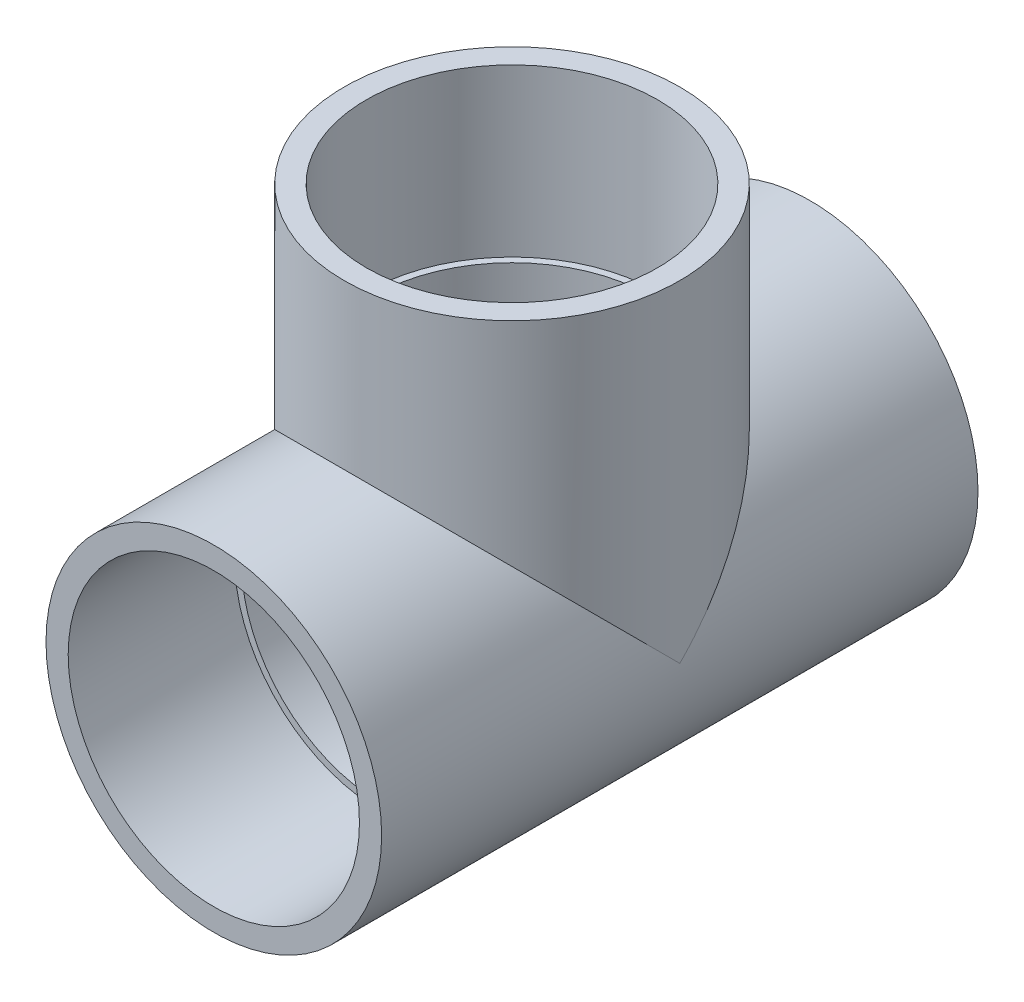
ISO-10303-21;
HEADER;
FILE_DESCRIPTION(('STEP AP214'),'2;1');
FILE_NAME('part.step','',(''),(''),'','','');
FILE_SCHEMA(('AUTOMOTIVE_DESIGN { 1 0 10303 214 1 1 1 1 }'));
ENDSEC;
DATA;
#1=APPLICATION_CONTEXT('core data for automotive mechanical design processes');
#2=APPLICATION_PROTOCOL_DEFINITION('international standard','automotive_design',2000,#1);
#3=PRODUCT_CONTEXT('',#1,'mechanical');
#4=PRODUCT('Part','Part','',(#3));
#5=PRODUCT_RELATED_PRODUCT_CATEGORY('part','',(#4));
#6=PRODUCT_DEFINITION_FORMATION('','',#4);
#7=PRODUCT_DEFINITION_CONTEXT('part definition',#1,'design');
#8=PRODUCT_DEFINITION('design','',#6,#7);
#9=PRODUCT_DEFINITION_SHAPE('','',#8);
#10=(LENGTH_UNIT() NAMED_UNIT(*) SI_UNIT(.MILLI.,.METRE.));
#11=(NAMED_UNIT(*) PLANE_ANGLE_UNIT() SI_UNIT($,.RADIAN.));
#12=(NAMED_UNIT(*) SI_UNIT($,.STERADIAN.) SOLID_ANGLE_UNIT());
#13=UNCERTAINTY_MEASURE_WITH_UNIT(LENGTH_MEASURE(1.E-05),#10,'distance_accuracy_value','');
#14=(GEOMETRIC_REPRESENTATION_CONTEXT(3) GLOBAL_UNCERTAINTY_ASSIGNED_CONTEXT((#13)) GLOBAL_UNIT_ASSIGNED_CONTEXT((#10,
#11,#12)) REPRESENTATION_CONTEXT('',''));
#15=CARTESIAN_POINT('',(0.,0.,0.));
#16=DIRECTION('',(0.,0.,1.));
#17=DIRECTION('',(1.,0.,0.));
#18=AXIS2_PLACEMENT_3D('',#15,#16,#17);
#19=CARTESIAN_POINT('',(0.,-19.20975,0.));
#20=DIRECTION('',(0.,1.,0.));
#21=DIRECTION('',(0.,0.,1.));
#22=AXIS2_PLACEMENT_3D('',#19,#20,#21);
#23=CYLINDRICAL_SURFACE('',#22,15.875);
#24=DIRECTION('',(0.,1.,0.));
#25=VECTOR('',#24,1.);
#26=CARTESIAN_POINT('',(-4.95696716122873,-19.20975,-15.08125));
#27=LINE('',#26,#25);
#28=CARTESIAN_POINT('',(-4.95696716122873,15.9146380142622,-15.08125));
#29=VERTEX_POINT('',#28);
#30=CARTESIAN_POINT('',(-4.95696716122871,15.08125,-15.08125));
#31=VERTEX_POINT('',#30);
#32=EDGE_CURVE('E11',#29,#31,#27,.F.);
#33=ORIENTED_EDGE('',*,*,#32,.F.);
#34=CARTESIAN_POINT('',(-4.95696716122873,15.9146380142622,-15.08125));
#35=CARTESIAN_POINT('',(-4.65183462890192,16.0097259451218,-15.1815889047642));
#36=CARTESIAN_POINT('',(-4.34128391480013,16.0967795439269,-15.2733544015873));
#37=CARTESIAN_POINT('',(-3.71092676901157,16.2536579955444,-15.4386042265133));
#38=CARTESIAN_POINT('',(-3.39111550476718,16.3234736649942,-15.5120788104566));
#39=CARTESIAN_POINT('',(-2.74453463538701,16.4445397561756,-15.6394267284181));
#40=CARTESIAN_POINT('',(-2.41777385075769,16.4958123794082,-15.6933235031964));
#41=CARTESIAN_POINT('',(-1.75915923195019,16.5789837090621,-15.7807250136814));
#42=CARTESIAN_POINT('',(-1.42730653113009,16.6108866644434,-15.8142342216392));
#43=CARTESIAN_POINT('',(-0.759609398359231,16.6548059696738,-15.8603597011864));
#44=CARTESIAN_POINT('',(-0.423754819022063,16.666749325366,-15.8728992849713));
#45=CARTESIAN_POINT('',(0.248225549854419,16.6702885713706,-15.876615506258));
#46=CARTESIAN_POINT('',(0.584351370647446,16.6618816280552,-15.8677891687143));
#47=CARTESIAN_POINT('',(1.25396731751022,16.6248948866689,-15.8289470117087));
#48=CARTESIAN_POINT('',(1.58745944984446,16.59633232747,-15.7989492998825));
#49=CARTESIAN_POINT('',(2.24952692115763,16.5196221631518,-15.7183481028989));
#50=CARTESIAN_POINT('',(2.57810370902756,16.4714804521898,-15.667750819084));
#51=CARTESIAN_POINT('',(3.25556478140146,16.3516512375056,-15.5417280360875));
#52=CARTESIAN_POINT('',(3.60384285497748,16.2783284156218,-15.4645769816068));
#53=CARTESIAN_POINT('',(4.1179248633398,16.1530501746161,-15.3326324084872));
#54=CARTESIAN_POINT('',(4.28778473863848,16.1087767170582,-15.2859847525171));
#55=CARTESIAN_POINT('',(4.62459774901306,16.0153317475723,-15.1874781028532));
#56=CARTESIAN_POINT('',(4.79155125400754,15.9661608644159,-15.1356197781404));
#57=CARTESIAN_POINT('',(4.95696716122873,15.9146380142622,-15.08125));
#58=B_SPLINE_CURVE_WITH_KNOTS('',3,(#34,#35,#36,#37,#38,#39,#40,#41,#42,#43,#44,#45,#46,#47,#48,
#49,#50,#51,#52,#53,#54,#55,#56,#57),.UNSPECIFIED.,.F.,.F.,(4,2,2,2,2,2,2,2,2,2,2,4),(0.,
1.00483999289581,2.01021415640429,3.014380573691,4.01832663583933,5.02593625380128,
6.03368618197726,7.04057523598532,8.04716139767047,9.1381159351191,9.68285986608592,
10.2275339482952),.UNSPECIFIED.);
#59=CARTESIAN_POINT('',(4.95696716122873,15.9146380142622,-15.08125));
#60=VERTEX_POINT('',#59);
#61=EDGE_CURVE('E88',#29,#60,#58,.T.);
#62=ORIENTED_EDGE('',*,*,#61,.T.);
#63=DIRECTION('',(0.,1.,0.));
#64=VECTOR('',#63,1.);
#65=CARTESIAN_POINT('',(4.95696716122873,-19.20975,-15.08125));
#66=LINE('',#65,#64);
#67=CARTESIAN_POINT('',(4.95696716122873,15.08125,-15.08125));
#68=VERTEX_POINT('',#67);
#69=EDGE_CURVE('E44',#68,#60,#66,.T.);
#70=ORIENTED_EDGE('',*,*,#69,.F.);
#71=CARTESIAN_POINT('',(0.,0.,0.));
#72=DIRECTION('',(0.,0.707106781186547,0.707106781186547));
#73=DIRECTION('',(0.,0.707106781186547,-0.707106781186547));
#74=AXIS2_PLACEMENT_3D('',#71,#72,#73);
#75=ELLIPSE('',#74,22.4506403026729,15.875);
#76=CARTESIAN_POINT('',(15.875,0.,0.));
#77=VERTEX_POINT('',#76);
#78=EDGE_CURVE('E106',#68,#77,#75,.F.);
#79=ORIENTED_EDGE('',*,*,#78,.T.);
#80=CARTESIAN_POINT('',(0.,0.,0.));
#81=DIRECTION('',(0.,0.707106781186547,-0.707106781186547));
#82=DIRECTION('',(0.,0.707106781186547,0.707106781186547));
#83=AXIS2_PLACEMENT_3D('',#80,#81,#82);
#84=ELLIPSE('',#83,22.4506403026729,15.875);
#85=CARTESIAN_POINT('',(4.95696716122873,15.08125,15.08125));
#86=VERTEX_POINT('',#85);
#87=EDGE_CURVE('E111',#77,#86,#84,.F.);
#88=ORIENTED_EDGE('',*,*,#87,.T.);
#89=DIRECTION('',(0.,1.,0.));
#90=VECTOR('',#89,1.);
#91=CARTESIAN_POINT('',(4.95696716122873,-19.20975,15.08125));
#92=LINE('',#91,#90);
#93=CARTESIAN_POINT('',(4.95696716122873,15.9146380142622,15.08125));
#94=VERTEX_POINT('',#93);
#95=EDGE_CURVE('E138',#94,#86,#92,.F.);
#96=ORIENTED_EDGE('',*,*,#95,.F.);
#97=CARTESIAN_POINT('',(4.95696716122873,15.9146380142622,15.08125));
#98=CARTESIAN_POINT('',(4.65183462890192,16.0097259451218,15.1815889047642));
#99=CARTESIAN_POINT('',(4.34128391480013,16.096779543927,15.2733544015873));
#100=CARTESIAN_POINT('',(3.71092676901157,16.2536579955444,15.4386042265133));
#101=CARTESIAN_POINT('',(3.39111550476718,16.3234736649942,15.5120788104566));
#102=CARTESIAN_POINT('',(2.74453463538701,16.4445397561756,15.6394267284181));
#103=CARTESIAN_POINT('',(2.41777385075769,16.4958123794082,15.6933235031964));
#104=CARTESIAN_POINT('',(1.75915923195018,16.5789837090621,15.7807250136814));
#105=CARTESIAN_POINT('',(1.42730653113009,16.6108866644434,15.8142342216392));
#106=CARTESIAN_POINT('',(0.75960939835923,16.6548059696738,15.8603597011864));
#107=CARTESIAN_POINT('',(0.423754819022063,16.666749325366,15.8728992849713));
#108=CARTESIAN_POINT('',(-0.248225549854419,16.6702885713706,15.876615506258));
#109=CARTESIAN_POINT('',(-0.584351370647447,16.6618816280552,15.8677891687143));
#110=CARTESIAN_POINT('',(-1.25396731751022,16.6248948866689,15.8289470117087));
#111=CARTESIAN_POINT('',(-1.58745944984446,16.59633232747,15.7989492998825));
#112=CARTESIAN_POINT('',(-2.24952692115763,16.5196221631518,15.7183481028989));
#113=CARTESIAN_POINT('',(-2.57810370902756,16.4714804521898,15.667750819084));
#114=CARTESIAN_POINT('',(-3.25556478140147,16.3516512375056,15.5417280360875));
#115=CARTESIAN_POINT('',(-3.60384285497748,16.2783284156218,15.4645769816068));
#116=CARTESIAN_POINT('',(-4.1179248633398,16.153050174616,15.3326324084872));
#117=CARTESIAN_POINT('',(-4.28778473863847,16.1087767170582,15.2859847525171));
#118=CARTESIAN_POINT('',(-4.62459774901306,16.0153317475723,15.1874781028532));
#119=CARTESIAN_POINT('',(-4.79155125400753,15.9661608644159,15.1356197781404));
#120=CARTESIAN_POINT('',(-4.95696716122873,15.9146380142622,15.08125));
#121=B_SPLINE_CURVE_WITH_KNOTS('',3,(#97,#98,#99,#100,#101,#102,#103,#104,#105,#106,#107,#108,
#109,#110,#111,#112,#113,#114,#115,#116,#117,#118,#119,#120),.UNSPECIFIED.,.F.,.F.,(4,2,2,2,2,2,
2,2,2,2,2,4),(0.,1.00483999289582,2.01021415640429,3.014380573691,4.01832663583933,
5.02593625380128,6.03368618197726,7.04057523598533,8.04716139767047,9.1381159351191,
9.68285986608592,10.2275339482952),.UNSPECIFIED.);
#122=CARTESIAN_POINT('',(-4.95696716122873,15.9146380142622,15.08125));
#123=VERTEX_POINT('',#122);
#124=EDGE_CURVE('E130',#94,#123,#121,.T.);
#125=ORIENTED_EDGE('',*,*,#124,.T.);
#126=DIRECTION('',(0.,1.,0.));
#127=VECTOR('',#126,1.);
#128=CARTESIAN_POINT('',(-4.95696716122873,-19.20975,15.08125));
#129=LINE('',#128,#127);
#130=CARTESIAN_POINT('',(-4.95696716122873,15.08125,15.08125));
#131=VERTEX_POINT('',#130);
#132=EDGE_CURVE('E128',#131,#123,#129,.T.);
#133=ORIENTED_EDGE('',*,*,#132,.F.);
#134=CARTESIAN_POINT('',(-15.875,0.,0.));
#135=VERTEX_POINT('',#134);
#136=EDGE_CURVE('E103',#131,#135,#84,.F.);
#137=ORIENTED_EDGE('',*,*,#136,.T.);
#138=EDGE_CURVE('E101',#135,#31,#75,.F.);
#139=ORIENTED_EDGE('',*,*,#138,.T.);
#140=EDGE_LOOP('',(#33,#62,#70,#79,#88,#96,#125,#133,#137,#139));
#141=FACE_BOUND('',#140,.T.);
#142=CARTESIAN_POINT('',(0.,18.89125,0.));
#143=DIRECTION('',(0.,1.,0.));
#144=DIRECTION('',(0.,0.,1.));
#145=AXIS2_PLACEMENT_3D('',#142,#143,#144);
#146=CIRCLE('',#145,15.875);
#147=CARTESIAN_POINT('',(0.,18.89125,15.875));
#148=VERTEX_POINT('',#147);
#149=EDGE_CURVE('E39',#148,#148,#146,.F.);
#150=ORIENTED_EDGE('',*,*,#149,.F.);
#151=EDGE_LOOP('',(#150));
#152=FACE_BOUND('',#151,.T.);
#153=ADVANCED_FACE('F35',(#141,#152),#23,.F.);
#154=CARTESIAN_POINT('',(0.,0.,-34.13125));
#155=DIRECTION('',(0.,0.,1.));
#156=DIRECTION('',(1.,0.,0.));
#157=AXIS2_PLACEMENT_3D('',#154,#155,#156);
#158=CYLINDRICAL_SURFACE('',#157,15.875);
#159=CARTESIAN_POINT('',(0.,0.,-15.08125));
#160=DIRECTION('',(0.,0.,-1.));
#161=DIRECTION('',(-1.,0.,0.));
#162=AXIS2_PLACEMENT_3D('',#159,#160,#161);
#163=CIRCLE('',#162,15.875);
#164=EDGE_CURVE('E50',#31,#68,#163,.F.);
#165=ORIENTED_EDGE('',*,*,#164,.F.);
#166=ORIENTED_EDGE('',*,*,#138,.F.);
#167=ORIENTED_EDGE('',*,*,#136,.F.);
#168=CARTESIAN_POINT('',(0.,0.,15.08125));
#169=DIRECTION('',(0.,0.,1.));
#170=DIRECTION('',(1.,0.,0.));
#171=AXIS2_PLACEMENT_3D('',#168,#169,#170);
#172=CIRCLE('',#171,15.875);
#173=EDGE_CURVE('E58',#86,#131,#172,.F.);
#174=ORIENTED_EDGE('',*,*,#173,.F.);
#175=ORIENTED_EDGE('',*,*,#87,.F.);
#176=ORIENTED_EDGE('',*,*,#78,.F.);
#177=EDGE_LOOP('',(#165,#166,#167,#174,#175,#176));
#178=FACE_BOUND('',#177,.T.);
#179=ADVANCED_FACE('F179',(#178),#158,.F.);
#180=CARTESIAN_POINT('',(0.,0.,118.243982536796));
#181=DIRECTION('',(0.,0.,-1.));
#182=DIRECTION('',(-1.,0.,0.));
#183=AXIS2_PLACEMENT_3D('',#180,#181,#182);
#184=CYLINDRICAL_SURFACE('',#183,19.20875);
#185=CARTESIAN_POINT('',(0.,0.,0.));
#186=DIRECTION('',(0.,-0.707106781186547,-0.707106781186547));
#187=DIRECTION('',(0.,0.707106781186547,-0.707106781186547));
#188=AXIS2_PLACEMENT_3D('',#185,#186,#187);
#189=ELLIPSE('',#188,27.1652747662341,19.20875);
#190=CARTESIAN_POINT('',(-19.2087499999999,0.,0.));
#191=VERTEX_POINT('',#190);
#192=CARTESIAN_POINT('',(19.20875,0.,0.));
#193=VERTEX_POINT('',#192);
#194=EDGE_CURVE('E122',#191,#193,#189,.T.);
#195=ORIENTED_EDGE('',*,*,#194,.T.);
#196=CARTESIAN_POINT('',(0.,0.,0.));
#197=DIRECTION('',(0.,0.707106781186547,-0.707106781186547));
#198=DIRECTION('',(0.,-0.707106781186547,-0.707106781186547));
#199=AXIS2_PLACEMENT_3D('',#196,#197,#198);
#200=ELLIPSE('',#199,27.1652747662341,19.20875);
#201=EDGE_CURVE('E125',#193,#191,#200,.F.);
#202=ORIENTED_EDGE('',*,*,#201,.T.);
#203=EDGE_LOOP('',(#195,#202));
#204=FACE_BOUND('',#203,.T.);
#205=CARTESIAN_POINT('',(0.,0.,-34.13125));
#206=DIRECTION('',(0.,0.,-1.));
#207=DIRECTION('',(-1.,0.,0.));
#208=AXIS2_PLACEMENT_3D('',#205,#206,#207);
#209=CIRCLE('',#208,19.20875);
#210=CARTESIAN_POINT('',(-19.2087499999999,0.,-34.13125));
#211=VERTEX_POINT('',#210);
#212=EDGE_CURVE('E119',#211,#211,#209,.T.);
#213=ORIENTED_EDGE('',*,*,#212,.F.);
#214=EDGE_LOOP('',(#213));
#215=FACE_BOUND('',#214,.T.);
#216=CARTESIAN_POINT('',(0.,0.,34.13125));
#217=DIRECTION('',(0.,0.,-1.));
#218=DIRECTION('',(-1.,0.,0.));
#219=AXIS2_PLACEMENT_3D('',#216,#217,#218);
#220=CIRCLE('',#219,19.20875);
#221=CARTESIAN_POINT('',(-19.2087499999999,0.,34.13125));
#222=VERTEX_POINT('',#221);
#223=EDGE_CURVE('E109',#222,#222,#220,.T.);
#224=ORIENTED_EDGE('',*,*,#223,.T.);
#225=EDGE_LOOP('',(#224));
#226=FACE_BOUND('',#225,.T.);
#227=ADVANCED_FACE('F37',(#204,#215,#226),#184,.T.);
#228=CARTESIAN_POINT('',(19.20875,0.,-34.13125));
#229=DIRECTION('',(0.,0.,1.));
#230=DIRECTION('',(1.,0.,0.));
#231=AXIS2_PLACEMENT_3D('',#228,#229,#230);
#232=PLANE('',#231);
#233=CARTESIAN_POINT('',(0.,0.,-34.13125));
#234=DIRECTION('',(0.,0.,-1.));
#235=DIRECTION('',(-1.,0.,0.));
#236=AXIS2_PLACEMENT_3D('',#233,#234,#235);
#237=CIRCLE('',#236,16.66875);
#238=CARTESIAN_POINT('',(-16.66875,0.,-34.13125));
#239=VERTEX_POINT('',#238);
#240=EDGE_CURVE('E96',#239,#239,#237,.T.);
#241=ORIENTED_EDGE('',*,*,#240,.F.);
#242=EDGE_LOOP('',(#241));
#243=FACE_BOUND('',#242,.T.);
#244=ORIENTED_EDGE('',*,*,#212,.T.);
#245=EDGE_LOOP('',(#244));
#246=FACE_BOUND('',#245,.T.);
#247=ADVANCED_FACE('F174',(#243,#246),#232,.F.);
#248=CARTESIAN_POINT('',(0.,0.,34.13125));
#249=DIRECTION('',(0.,0.,-1.));
#250=DIRECTION('',(-1.,0.,0.));
#251=AXIS2_PLACEMENT_3D('',#248,#249,#250);
#252=PLANE('',#251);
#253=CARTESIAN_POINT('',(0.,0.,34.13125));
#254=DIRECTION('',(0.,0.,1.));
#255=DIRECTION('',(1.,0.,0.));
#256=AXIS2_PLACEMENT_3D('',#253,#254,#255);
#257=CIRCLE('',#256,16.66875);
#258=CARTESIAN_POINT('',(16.66875,0.,34.13125));
#259=VERTEX_POINT('',#258);
#260=EDGE_CURVE('E163',#259,#259,#257,.T.);
#261=ORIENTED_EDGE('',*,*,#260,.F.);
#262=EDGE_LOOP('',(#261));
#263=FACE_BOUND('',#262,.T.);
#264=ORIENTED_EDGE('',*,*,#223,.F.);
#265=EDGE_LOOP('',(#264));
#266=FACE_BOUND('',#265,.T.);
#267=ADVANCED_FACE('F170',(#263,#266),#252,.F.);
#268=CARTESIAN_POINT('',(0.,0.,0.));
#269=DIRECTION('',(0.,1.,0.));
#270=DIRECTION('',(0.,0.,1.));
#271=AXIS2_PLACEMENT_3D('',#268,#269,#270);
#272=CYLINDRICAL_SURFACE('',#271,19.2087499999999);
#273=CARTESIAN_POINT('',(0.,37.94125,0.));
#274=DIRECTION('',(0.,1.,0.));
#275=DIRECTION('',(0.,0.,1.));
#276=AXIS2_PLACEMENT_3D('',#273,#274,#275);
#277=CIRCLE('',#276,19.2087499999999);
#278=CARTESIAN_POINT('',(0.,37.94125,19.2087499999999));
#279=VERTEX_POINT('',#278);
#280=EDGE_CURVE('E105',#279,#279,#277,.T.);
#281=ORIENTED_EDGE('',*,*,#280,.F.);
#282=EDGE_LOOP('',(#281));
#283=FACE_BOUND('',#282,.T.);
#284=ORIENTED_EDGE('',*,*,#201,.F.);
#285=ORIENTED_EDGE('',*,*,#194,.F.);
#286=EDGE_LOOP('',(#284,#285));
#287=FACE_BOUND('',#286,.T.);
#288=ADVANCED_FACE('F173',(#283,#287),#272,.T.);
#289=CARTESIAN_POINT('',(0.,37.94125,0.));
#290=DIRECTION('',(0.,1.,0.));
#291=DIRECTION('',(0.,0.,1.));
#292=AXIS2_PLACEMENT_3D('',#289,#290,#291);
#293=PLANE('',#292);
#294=CARTESIAN_POINT('',(0.,37.94125,0.));
#295=DIRECTION('',(0.,1.,0.));
#296=DIRECTION('',(0.,0.,1.));
#297=AXIS2_PLACEMENT_3D('',#294,#295,#296);
#298=CIRCLE('',#297,16.66875);
#299=CARTESIAN_POINT('',(0.,37.94125,16.66875));
#300=VERTEX_POINT('',#299);
#301=EDGE_CURVE('E250',#300,#300,#298,.T.);
#302=ORIENTED_EDGE('',*,*,#301,.F.);
#303=EDGE_LOOP('',(#302));
#304=FACE_BOUND('',#303,.T.);
#305=ORIENTED_EDGE('',*,*,#280,.T.);
#306=EDGE_LOOP('',(#305));
#307=FACE_BOUND('',#306,.T.);
#308=ADVANCED_FACE('F147',(#304,#307),#293,.T.);
#309=CARTESIAN_POINT('',(0.,0.,15.08125));
#310=DIRECTION('',(0.,0.,1.));
#311=DIRECTION('',(1.,0.,0.));
#312=AXIS2_PLACEMENT_3D('',#309,#310,#311);
#313=CYLINDRICAL_SURFACE('',#312,16.66875);
#314=ORIENTED_EDGE('',*,*,#260,.T.);
#315=EDGE_LOOP('',(#314));
#316=FACE_BOUND('',#315,.T.);
#317=CARTESIAN_POINT('',(0.,0.,15.08125));
#318=DIRECTION('',(0.,0.,1.));
#319=DIRECTION('',(1.,0.,0.));
#320=AXIS2_PLACEMENT_3D('',#317,#318,#319);
#321=CIRCLE('',#320,16.66875);
#322=EDGE_CURVE('E164',#123,#94,#321,.T.);
#323=ORIENTED_EDGE('',*,*,#322,.F.);
#324=ORIENTED_EDGE('',*,*,#124,.F.);
#325=EDGE_LOOP('',(#323,#324));
#326=FACE_BOUND('',#325,.T.);
#327=ADVANCED_FACE('F142',(#316,#326),#313,.F.);
#328=CARTESIAN_POINT('',(0.,0.,15.08125));
#329=DIRECTION('',(0.,0.,1.));
#330=DIRECTION('',(1.,0.,0.));
#331=AXIS2_PLACEMENT_3D('',#328,#329,#330);
#332=PLANE('',#331);
#333=ORIENTED_EDGE('',*,*,#95,.T.);
#334=ORIENTED_EDGE('',*,*,#173,.T.);
#335=ORIENTED_EDGE('',*,*,#132,.T.);
#336=ORIENTED_EDGE('',*,*,#322,.T.);
#337=EDGE_LOOP('',(#333,#334,#335,#336));
#338=FACE_BOUND('',#337,.T.);
#339=ADVANCED_FACE('F146',(#338),#332,.T.);
#340=CARTESIAN_POINT('',(0.,0.,-15.08125));
#341=DIRECTION('',(0.,0.,-1.));
#342=DIRECTION('',(-1.,0.,0.));
#343=AXIS2_PLACEMENT_3D('',#340,#341,#342);
#344=PLANE('',#343);
#345=ORIENTED_EDGE('',*,*,#32,.T.);
#346=ORIENTED_EDGE('',*,*,#164,.T.);
#347=ORIENTED_EDGE('',*,*,#69,.T.);
#348=CARTESIAN_POINT('',(0.,0.,-15.08125));
#349=DIRECTION('',(0.,0.,-1.));
#350=DIRECTION('',(-1.,0.,0.));
#351=AXIS2_PLACEMENT_3D('',#348,#349,#350);
#352=CIRCLE('',#351,16.66875);
#353=EDGE_CURVE('E91',#60,#29,#352,.T.);
#354=ORIENTED_EDGE('',*,*,#353,.T.);
#355=EDGE_LOOP('',(#345,#346,#347,#354));
#356=FACE_BOUND('',#355,.T.);
#357=ADVANCED_FACE('F95',(#356),#344,.T.);
#358=CARTESIAN_POINT('',(0.,0.,-15.08125));
#359=DIRECTION('',(0.,0.,-1.));
#360=DIRECTION('',(-1.,0.,0.));
#361=AXIS2_PLACEMENT_3D('',#358,#359,#360);
#362=CYLINDRICAL_SURFACE('',#361,16.66875);
#363=ORIENTED_EDGE('',*,*,#240,.T.);
#364=EDGE_LOOP('',(#363));
#365=FACE_BOUND('',#364,.T.);
#366=ORIENTED_EDGE('',*,*,#353,.F.);
#367=ORIENTED_EDGE('',*,*,#61,.F.);
#368=EDGE_LOOP('',(#366,#367));
#369=FACE_BOUND('',#368,.T.);
#370=ADVANCED_FACE('F90',(#365,#369),#362,.F.);
#371=CARTESIAN_POINT('',(0.,18.89125,0.));
#372=DIRECTION('',(0.,1.,0.));
#373=DIRECTION('',(0.,0.,1.));
#374=AXIS2_PLACEMENT_3D('',#371,#372,#373);
#375=PLANE('',#374);
#376=CARTESIAN_POINT('',(0.,18.89125,0.));
#377=DIRECTION('',(0.,1.,0.));
#378=DIRECTION('',(0.,0.,1.));
#379=AXIS2_PLACEMENT_3D('',#376,#377,#378);
#380=CIRCLE('',#379,16.66875);
#381=CARTESIAN_POINT('',(0.,18.89125,16.66875));
#382=VERTEX_POINT('',#381);
#383=EDGE_CURVE('E247',#382,#382,#380,.T.);
#384=ORIENTED_EDGE('',*,*,#383,.T.);
#385=EDGE_LOOP('',(#384));
#386=FACE_BOUND('',#385,.T.);
#387=ORIENTED_EDGE('',*,*,#149,.T.);
#388=EDGE_LOOP('',(#387));
#389=FACE_BOUND('',#388,.T.);
#390=ADVANCED_FACE('F154',(#386,#389),#375,.T.);
#391=CARTESIAN_POINT('',(0.,18.89125,0.));
#392=DIRECTION('',(0.,1.,0.));
#393=DIRECTION('',(0.,0.,1.));
#394=AXIS2_PLACEMENT_3D('',#391,#392,#393);
#395=CYLINDRICAL_SURFACE('',#394,16.66875);
#396=CARTESIAN_POINT('',(0.,18.89125,16.66875));
#397=CARTESIAN_POINT('',(0.,19.0896875,16.66875));
#398=CARTESIAN_POINT('',(0.,19.288125,16.66875));
#399=CARTESIAN_POINT('',(0.,19.685,16.66875));
#400=CARTESIAN_POINT('',(0.,19.8834375,16.66875));
#401=CARTESIAN_POINT('',(0.,20.2803125,16.66875));
#402=CARTESIAN_POINT('',(0.,20.47875,16.66875));
#403=CARTESIAN_POINT('',(0.,20.875625,16.66875));
#404=CARTESIAN_POINT('',(0.,21.0740625,16.66875));
#405=CARTESIAN_POINT('',(0.,21.4709375,16.66875));
#406=CARTESIAN_POINT('',(0.,21.669375,16.66875));
#407=CARTESIAN_POINT('',(0.,22.06625,16.66875));
#408=CARTESIAN_POINT('',(0.,22.2646875,16.66875));
#409=CARTESIAN_POINT('',(0.,22.6615625,16.66875));
#410=CARTESIAN_POINT('',(0.,22.86,16.66875));
#411=CARTESIAN_POINT('',(0.,23.256875,16.66875));
#412=CARTESIAN_POINT('',(0.,23.4553125,16.66875));
#413=CARTESIAN_POINT('',(0.,23.8521875,16.66875));
#414=CARTESIAN_POINT('',(0.,24.050625,16.66875));
#415=CARTESIAN_POINT('',(0.,24.4475,16.66875));
#416=CARTESIAN_POINT('',(0.,24.6459375,16.66875));
#417=CARTESIAN_POINT('',(0.,25.0428125,16.66875));
#418=CARTESIAN_POINT('',(0.,25.24125,16.66875));
#419=CARTESIAN_POINT('',(0.,25.638125,16.66875));
#420=CARTESIAN_POINT('',(0.,25.8365625,16.66875));
#421=CARTESIAN_POINT('',(0.,26.2334375,16.66875));
#422=CARTESIAN_POINT('',(0.,26.431875,16.66875));
#423=CARTESIAN_POINT('',(0.,26.82875,16.66875));
#424=CARTESIAN_POINT('',(0.,27.0271875,16.66875));
#425=CARTESIAN_POINT('',(0.,27.4240625,16.66875));
#426=CARTESIAN_POINT('',(0.,27.6225,16.66875));
#427=CARTESIAN_POINT('',(0.,28.019375,16.66875));
#428=CARTESIAN_POINT('',(0.,28.2178125,16.66875));
#429=CARTESIAN_POINT('',(0.,28.6146875,16.66875));
#430=CARTESIAN_POINT('',(0.,28.813125,16.66875));
#431=CARTESIAN_POINT('',(0.,29.21,16.66875));
#432=CARTESIAN_POINT('',(0.,29.4084375,16.66875));
#433=CARTESIAN_POINT('',(0.,29.8053125,16.66875));
#434=CARTESIAN_POINT('',(0.,30.00375,16.66875));
#435=CARTESIAN_POINT('',(0.,30.400625,16.66875));
#436=CARTESIAN_POINT('',(0.,30.5990625,16.66875));
#437=CARTESIAN_POINT('',(0.,30.9959375,16.66875));
#438=CARTESIAN_POINT('',(0.,31.194375,16.66875));
#439=CARTESIAN_POINT('',(0.,31.59125,16.66875));
#440=CARTESIAN_POINT('',(0.,31.7896875,16.66875));
#441=CARTESIAN_POINT('',(0.,32.1865625,16.66875));
#442=CARTESIAN_POINT('',(0.,32.385,16.66875));
#443=CARTESIAN_POINT('',(0.,32.781875,16.66875));
#444=CARTESIAN_POINT('',(0.,32.9803125,16.66875));
#445=CARTESIAN_POINT('',(0.,33.3771875,16.66875));
#446=CARTESIAN_POINT('',(0.,33.575625,16.66875));
#447=CARTESIAN_POINT('',(0.,33.9725,16.66875));
#448=CARTESIAN_POINT('',(0.,34.1709375,16.66875));
#449=CARTESIAN_POINT('',(0.,34.5678125,16.66875));
#450=CARTESIAN_POINT('',(0.,34.76625,16.66875));
#451=CARTESIAN_POINT('',(0.,35.163125,16.66875));
#452=CARTESIAN_POINT('',(0.,35.3615625,16.66875));
#453=CARTESIAN_POINT('',(0.,35.7584375,16.66875));
#454=CARTESIAN_POINT('',(0.,35.956875,16.66875));
#455=CARTESIAN_POINT('',(0.,36.35375,16.66875));
#456=CARTESIAN_POINT('',(0.,36.5521875,16.66875));
#457=CARTESIAN_POINT('',(0.,36.9490625,16.66875));
#458=CARTESIAN_POINT('',(0.,37.1475,16.66875));
#459=CARTESIAN_POINT('',(0.,37.544375,16.66875));
#460=CARTESIAN_POINT('',(0.,37.7428125,16.66875));
#461=CARTESIAN_POINT('',(0.,37.94125,16.66875));
#462=B_SPLINE_CURVE_WITH_KNOTS('',3,(#396,#397,#398,#399,#400,#401,#402,#403,#404,#405,#406,
#407,#408,#409,#410,#411,#412,#413,#414,#415,#416,#417,#418,#419,#420,#421,#422,#423,#424,#425,
#426,#427,#428,#429,#430,#431,#432,#433,#434,#435,#436,#437,#438,#439,#440,#441,#442,#443,#444,
#445,#446,#447,#448,#449,#450,#451,#452,#453,#454,#455,#456,#457,#458,#459,#460,#461),
.UNSPECIFIED.,.F.,.F.,(4,2,2,2,2,2,2,2,2,2,2,2,2,2,2,2,2,2,2,2,2,2,2,2,2,2,2,2,2,2,2,2,4),(0.,
0.5953125,1.190625,1.7859375,2.38125,2.9765625,3.571875,4.1671875,4.7625,5.3578125,5.953125,
6.5484375,7.14375,7.7390625,8.334375,8.92968750000001,9.52500000000001,10.1203125,10.715625,
11.3109375,11.90625,12.5015625,13.096875,13.6921875,14.2875,14.8828125,15.478125,16.0734375,
16.66875,17.2640625,17.859375,18.4546875,19.05),.UNSPECIFIED.);
#463=EDGE_CURVE('BSEAM228',#382,#300,#462,.T.);
#464=ORIENTED_EDGE('',*,*,#383,.F.);
#465=ORIENTED_EDGE('',*,*,#301,.T.);
#466=ORIENTED_EDGE('',*,*,#463,.T.);
#467=ORIENTED_EDGE('',*,*,#463,.F.);
#468=EDGE_LOOP('',(#464,#466,#465,#467));
#469=FACE_BOUND('',#468,.T.);
#470=ADVANCED_FACE('F228',(#469),#395,.F.);
#471=CLOSED_SHELL('',(#153,#179,#227,#247,#267,#288,#308,#327,#339,#357,#370,#390,#470));
#472=MANIFOLD_SOLID_BREP('B2',#471);
#473=ADVANCED_BREP_SHAPE_REPRESENTATION('',(#18,#472),#14);
#474=SHAPE_DEFINITION_REPRESENTATION(#9,#473);
ENDSEC;
END-ISO-10303-21;
